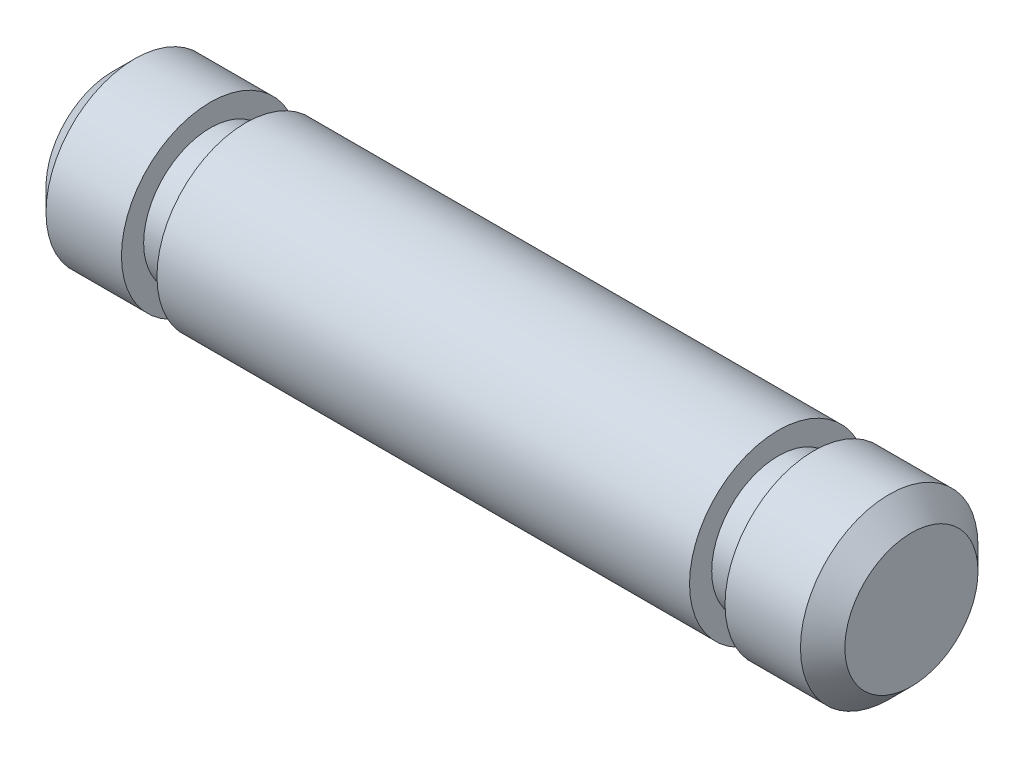
ISO-10303-21;
HEADER;
FILE_DESCRIPTION(('STEP AP214'),'2;1');
FILE_NAME('part.step','',(''),(''),'','','');
FILE_SCHEMA(('AUTOMOTIVE_DESIGN { 1 0 10303 214 1 1 1 1 }'));
ENDSEC;
DATA;
#1=APPLICATION_CONTEXT('core data for automotive mechanical design processes');
#2=APPLICATION_PROTOCOL_DEFINITION('international standard','automotive_design',2000,#1);
#3=PRODUCT_CONTEXT('',#1,'mechanical');
#4=PRODUCT('Part','Part','',(#3));
#5=PRODUCT_RELATED_PRODUCT_CATEGORY('part','',(#4));
#6=PRODUCT_DEFINITION_FORMATION('','',#4);
#7=PRODUCT_DEFINITION_CONTEXT('part definition',#1,'design');
#8=PRODUCT_DEFINITION('design','',#6,#7);
#9=PRODUCT_DEFINITION_SHAPE('','',#8);
#10=(LENGTH_UNIT() NAMED_UNIT(*) SI_UNIT(.MILLI.,.METRE.));
#11=(NAMED_UNIT(*) PLANE_ANGLE_UNIT() SI_UNIT($,.RADIAN.));
#12=(NAMED_UNIT(*) SI_UNIT($,.STERADIAN.) SOLID_ANGLE_UNIT());
#13=UNCERTAINTY_MEASURE_WITH_UNIT(LENGTH_MEASURE(1.E-05),#10,'distance_accuracy_value','');
#14=(GEOMETRIC_REPRESENTATION_CONTEXT(3) GLOBAL_UNCERTAINTY_ASSIGNED_CONTEXT((#13)) GLOBAL_UNIT_ASSIGNED_CONTEXT((#10,
#11,#12)) REPRESENTATION_CONTEXT('',''));
#15=CARTESIAN_POINT('',(0.,0.,0.));
#16=DIRECTION('',(0.,0.,1.));
#17=DIRECTION('',(1.,0.,0.));
#18=AXIS2_PLACEMENT_3D('',#15,#16,#17);
#19=CARTESIAN_POINT('',(9.,0.,0.));
#20=DIRECTION('',(-1.,0.,0.));
#21=DIRECTION('',(0.,0.,1.));
#22=AXIS2_PLACEMENT_3D('',#19,#20,#21);
#23=CYLINDRICAL_SURFACE('',#22,2.);
#24=CARTESIAN_POINT('',(-6.,0.,0.));
#25=DIRECTION('',(-1.,0.,0.));
#26=DIRECTION('',(0.,0.,1.));
#27=AXIS2_PLACEMENT_3D('',#24,#25,#26);
#28=CIRCLE('',#27,2.);
#29=CARTESIAN_POINT('',(-6.,0.,2.));
#30=VERTEX_POINT('',#29);
#31=EDGE_CURVE('E52',#30,#30,#28,.T.);
#32=ORIENTED_EDGE('',*,*,#31,.F.);
#33=EDGE_LOOP('',(#32));
#34=FACE_BOUND('',#33,.T.);
#35=CARTESIAN_POINT('',(6.,0.,0.));
#36=DIRECTION('',(-1.,0.,0.));
#37=DIRECTION('',(0.,0.,1.));
#38=AXIS2_PLACEMENT_3D('',#35,#36,#37);
#39=CIRCLE('',#38,2.);
#40=CARTESIAN_POINT('',(6.,0.,2.));
#41=VERTEX_POINT('',#40);
#42=EDGE_CURVE('E64',#41,#41,#39,.T.);
#43=ORIENTED_EDGE('',*,*,#42,.T.);
#44=EDGE_LOOP('',(#43));
#45=FACE_BOUND('',#44,.T.);
#46=ADVANCED_FACE('F31',(#34,#45),#23,.T.);
#47=CARTESIAN_POINT('',(-6.8,0.,0.));
#48=DIRECTION('',(-1.,0.,0.));
#49=DIRECTION('',(0.,0.,1.));
#50=AXIS2_PLACEMENT_3D('',#47,#48,#49);
#51=CIRCLE('',#50,2.);
#52=CARTESIAN_POINT('',(-6.8,0.,2.));
#53=VERTEX_POINT('',#52);
#54=EDGE_CURVE('E51',#53,#53,#51,.T.);
#55=ORIENTED_EDGE('',*,*,#54,.T.);
#56=EDGE_LOOP('',(#55));
#57=FACE_BOUND('',#56,.T.);
#58=CARTESIAN_POINT('',(-8.49999999999999,0.,0.));
#59=DIRECTION('',(1.,0.,0.));
#60=DIRECTION('',(0.,0.,-1.));
#61=AXIS2_PLACEMENT_3D('',#58,#59,#60);
#62=CIRCLE('',#61,2.);
#63=CARTESIAN_POINT('',(-8.49999999999999,0.,-2.));
#64=VERTEX_POINT('',#63);
#65=EDGE_CURVE('E42',#64,#64,#62,.T.);
#66=ORIENTED_EDGE('',*,*,#65,.T.);
#67=EDGE_LOOP('',(#66));
#68=FACE_BOUND('',#67,.T.);
#69=ADVANCED_FACE('F91',(#57,#68),#23,.T.);
#70=CARTESIAN_POINT('',(-9.,0.,0.));
#71=DIRECTION('',(1.,0.,0.));
#72=DIRECTION('',(0.,0.,-1.));
#73=AXIS2_PLACEMENT_3D('',#70,#71,#72);
#74=PLANE('',#73);
#75=CARTESIAN_POINT('',(-9.,0.,0.));
#76=DIRECTION('',(1.,0.,0.));
#77=DIRECTION('',(0.,0.,-1.));
#78=AXIS2_PLACEMENT_3D('',#75,#76,#77);
#79=CIRCLE('',#78,1.49999999999999);
#80=CARTESIAN_POINT('',(-9.,0.,-1.49999999999999));
#81=VERTEX_POINT('',#80);
#82=EDGE_CURVE('E38',#81,#81,#79,.F.);
#83=ORIENTED_EDGE('',*,*,#82,.T.);
#84=EDGE_LOOP('',(#83));
#85=FACE_BOUND('',#84,.T.);
#86=ADVANCED_FACE('F106',(#85),#74,.F.);
#87=CARTESIAN_POINT('',(-8.49999999999999,0.,0.));
#88=DIRECTION('',(1.,0.,0.));
#89=DIRECTION('',(0.,0.,-1.));
#90=AXIS2_PLACEMENT_3D('',#87,#88,#89);
#91=CONICAL_SURFACE('',#90,2.,0.785398163397447);
#92=ORIENTED_EDGE('',*,*,#82,.F.);
#93=EDGE_LOOP('',(#92));
#94=FACE_BOUND('',#93,.T.);
#95=ORIENTED_EDGE('',*,*,#65,.F.);
#96=EDGE_LOOP('',(#95));
#97=FACE_BOUND('',#96,.T.);
#98=ADVANCED_FACE('F111',(#94,#97),#91,.T.);
#99=CARTESIAN_POINT('',(-6.8,0.,0.));
#100=DIRECTION('',(-1.,0.,0.));
#101=DIRECTION('',(0.,0.,1.));
#102=AXIS2_PLACEMENT_3D('',#99,#100,#101);
#103=PLANE('',#102);
#104=ORIENTED_EDGE('',*,*,#54,.F.);
#105=EDGE_LOOP('',(#104));
#106=FACE_BOUND('',#105,.T.);
#107=CARTESIAN_POINT('',(-6.8,0.,0.));
#108=DIRECTION('',(-1.,0.,0.));
#109=DIRECTION('',(0.,0.,1.));
#110=AXIS2_PLACEMENT_3D('',#107,#108,#109);
#111=CIRCLE('',#110,1.5);
#112=CARTESIAN_POINT('',(-6.8,0.,1.5));
#113=VERTEX_POINT('',#112);
#114=EDGE_CURVE('E55',#113,#113,#111,.T.);
#115=ORIENTED_EDGE('',*,*,#114,.T.);
#116=EDGE_LOOP('',(#115));
#117=FACE_BOUND('',#116,.T.);
#118=ADVANCED_FACE('F113',(#106,#117),#103,.F.);
#119=CARTESIAN_POINT('',(-6.,0.,0.));
#120=DIRECTION('',(-1.,0.,0.));
#121=DIRECTION('',(0.,0.,1.));
#122=AXIS2_PLACEMENT_3D('',#119,#120,#121);
#123=PLANE('',#122);
#124=ORIENTED_EDGE('',*,*,#31,.T.);
#125=EDGE_LOOP('',(#124));
#126=FACE_BOUND('',#125,.T.);
#127=CARTESIAN_POINT('',(-6.,0.,0.));
#128=DIRECTION('',(-1.,0.,0.));
#129=DIRECTION('',(0.,0.,1.));
#130=AXIS2_PLACEMENT_3D('',#127,#128,#129);
#131=CIRCLE('',#130,1.5);
#132=CARTESIAN_POINT('',(-6.,0.,1.5));
#133=VERTEX_POINT('',#132);
#134=EDGE_CURVE('E58',#133,#133,#131,.T.);
#135=ORIENTED_EDGE('',*,*,#134,.F.);
#136=EDGE_LOOP('',(#135));
#137=FACE_BOUND('',#136,.T.);
#138=ADVANCED_FACE('F119',(#126,#137),#123,.T.);
#139=CARTESIAN_POINT('',(-6.8,0.,0.));
#140=DIRECTION('',(1.,0.,0.));
#141=DIRECTION('',(0.,0.,-1.));
#142=AXIS2_PLACEMENT_3D('',#139,#140,#141);
#143=CYLINDRICAL_SURFACE('',#142,1.5);
#144=ORIENTED_EDGE('',*,*,#114,.F.);
#145=EDGE_LOOP('',(#144));
#146=FACE_BOUND('',#145,.T.);
#147=ORIENTED_EDGE('',*,*,#134,.T.);
#148=EDGE_LOOP('',(#147));
#149=FACE_BOUND('',#148,.T.);
#150=ADVANCED_FACE('F83',(#146,#149),#143,.T.);
#151=CARTESIAN_POINT('',(6.8,0.,0.));
#152=DIRECTION('',(1.,0.,0.));
#153=DIRECTION('',(0.,0.,1.));
#154=AXIS2_PLACEMENT_3D('',#151,#152,#153);
#155=PLANE('',#154);
#156=CARTESIAN_POINT('',(6.8,0.,0.));
#157=DIRECTION('',(-1.,0.,0.));
#158=DIRECTION('',(0.,0.,1.));
#159=AXIS2_PLACEMENT_3D('',#156,#157,#158);
#160=CIRCLE('',#159,1.5);
#161=CARTESIAN_POINT('',(6.8,0.,1.5));
#162=VERTEX_POINT('',#161);
#163=EDGE_CURVE('E67',#162,#162,#160,.T.);
#164=ORIENTED_EDGE('',*,*,#163,.F.);
#165=EDGE_LOOP('',(#164));
#166=FACE_BOUND('',#165,.T.);
#167=CARTESIAN_POINT('',(6.8,0.,0.));
#168=DIRECTION('',(-1.,0.,0.));
#169=DIRECTION('',(0.,0.,1.));
#170=AXIS2_PLACEMENT_3D('',#167,#168,#169);
#171=CIRCLE('',#170,2.);
#172=CARTESIAN_POINT('',(6.8,0.,2.));
#173=VERTEX_POINT('',#172);
#174=EDGE_CURVE('E61',#173,#173,#171,.T.);
#175=ORIENTED_EDGE('',*,*,#174,.T.);
#176=EDGE_LOOP('',(#175));
#177=FACE_BOUND('',#176,.T.);
#178=ADVANCED_FACE('F79',(#166,#177),#155,.F.);
#179=CARTESIAN_POINT('',(6.,0.,0.));
#180=DIRECTION('',(1.,0.,0.));
#181=DIRECTION('',(0.,0.,1.));
#182=AXIS2_PLACEMENT_3D('',#179,#180,#181);
#183=PLANE('',#182);
#184=CARTESIAN_POINT('',(6.,0.,0.));
#185=DIRECTION('',(-1.,0.,0.));
#186=DIRECTION('',(0.,0.,1.));
#187=AXIS2_PLACEMENT_3D('',#184,#185,#186);
#188=CIRCLE('',#187,1.5);
#189=CARTESIAN_POINT('',(6.,0.,1.5));
#190=VERTEX_POINT('',#189);
#191=EDGE_CURVE('E70',#190,#190,#188,.T.);
#192=ORIENTED_EDGE('',*,*,#191,.T.);
#193=EDGE_LOOP('',(#192));
#194=FACE_BOUND('',#193,.T.);
#195=ORIENTED_EDGE('',*,*,#42,.F.);
#196=EDGE_LOOP('',(#195));
#197=FACE_BOUND('',#196,.T.);
#198=ADVANCED_FACE('F82',(#194,#197),#183,.T.);
#199=CARTESIAN_POINT('',(6.8,0.,0.));
#200=DIRECTION('',(-1.,0.,0.));
#201=DIRECTION('',(0.,0.,1.));
#202=AXIS2_PLACEMENT_3D('',#199,#200,#201);
#203=CYLINDRICAL_SURFACE('',#202,1.5);
#204=ORIENTED_EDGE('',*,*,#163,.T.);
#205=EDGE_LOOP('',(#204));
#206=FACE_BOUND('',#205,.T.);
#207=ORIENTED_EDGE('',*,*,#191,.F.);
#208=EDGE_LOOP('',(#207));
#209=FACE_BOUND('',#208,.T.);
#210=ADVANCED_FACE('F76',(#206,#209),#203,.T.);
#211=CARTESIAN_POINT('',(9.,0.,0.));
#212=DIRECTION('',(1.,0.,0.));
#213=DIRECTION('',(0.,0.,-1.));
#214=AXIS2_PLACEMENT_3D('',#211,#212,#213);
#215=PLANE('',#214);
#216=CARTESIAN_POINT('',(9.,0.,0.));
#217=DIRECTION('',(1.,0.,0.));
#218=DIRECTION('',(0.,0.,-1.));
#219=AXIS2_PLACEMENT_3D('',#216,#217,#218);
#220=CIRCLE('',#219,1.5);
#221=CARTESIAN_POINT('',(9.,0.,-1.5));
#222=VERTEX_POINT('',#221);
#223=EDGE_CURVE('E10',#222,#222,#220,.T.);
#224=ORIENTED_EDGE('',*,*,#223,.T.);
#225=EDGE_LOOP('',(#224));
#226=FACE_BOUND('',#225,.T.);
#227=ADVANCED_FACE('F96',(#226),#215,.T.);
#228=CARTESIAN_POINT('',(9.,0.,0.));
#229=DIRECTION('',(-1.,0.,0.));
#230=DIRECTION('',(0.,0.,1.));
#231=AXIS2_PLACEMENT_3D('',#228,#229,#230);
#232=CONICAL_SURFACE('',#231,1.5,0.785398163397447);
#233=CARTESIAN_POINT('',(8.5,0.,0.));
#234=DIRECTION('',(1.,0.,0.));
#235=DIRECTION('',(0.,0.,-1.));
#236=AXIS2_PLACEMENT_3D('',#233,#234,#235);
#237=CIRCLE('',#236,2.);
#238=CARTESIAN_POINT('',(8.5,0.,-2.));
#239=VERTEX_POINT('',#238);
#240=EDGE_CURVE('E46',#239,#239,#237,.F.);
#241=ORIENTED_EDGE('',*,*,#240,.F.);
#242=EDGE_LOOP('',(#241));
#243=FACE_BOUND('',#242,.T.);
#244=ORIENTED_EDGE('',*,*,#223,.F.);
#245=EDGE_LOOP('',(#244));
#246=FACE_BOUND('',#245,.T.);
#247=ADVANCED_FACE('F33',(#243,#246),#232,.T.);
#248=ORIENTED_EDGE('',*,*,#174,.F.);
#249=EDGE_LOOP('',(#248));
#250=FACE_BOUND('',#249,.T.);
#251=ORIENTED_EDGE('',*,*,#240,.T.);
#252=EDGE_LOOP('',(#251));
#253=FACE_BOUND('',#252,.T.);
#254=ADVANCED_FACE('F87',(#250,#253),#23,.T.);
#255=CLOSED_SHELL('',(#46,#69,#86,#98,#118,#138,#150,#178,#198,#210,#227,#247,#254));
#256=MANIFOLD_SOLID_BREP('B2',#255);
#257=ADVANCED_BREP_SHAPE_REPRESENTATION('',(#18,#256),#14);
#258=SHAPE_DEFINITION_REPRESENTATION(#9,#257);
ENDSEC;
END-ISO-10303-21;
